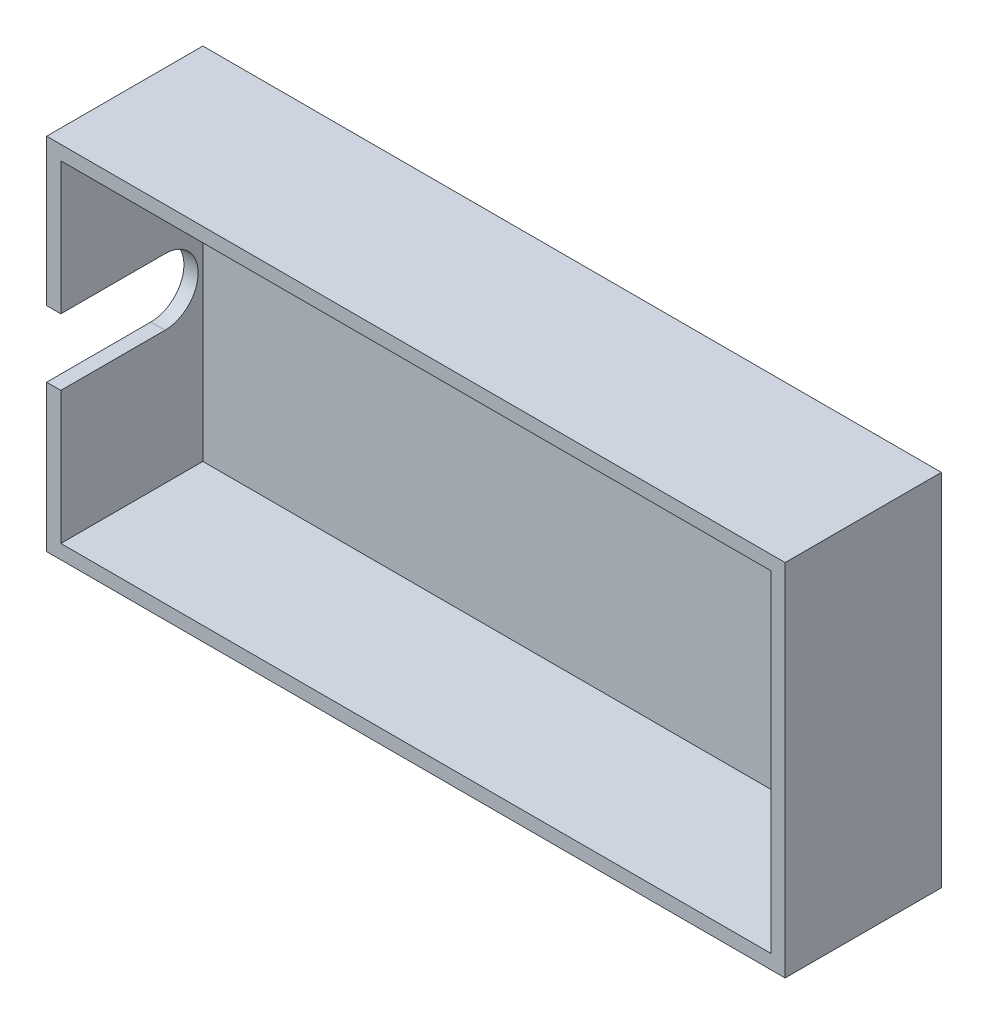
ISO-10303-21;
HEADER;
FILE_DESCRIPTION(('STEP AP214'),'2;1');
FILE_NAME('part.step','',(''),(''),'','','');
FILE_SCHEMA(('AUTOMOTIVE_DESIGN { 1 0 10303 214 1 1 1 1 }'));
ENDSEC;
DATA;
#1=APPLICATION_CONTEXT('core data for automotive mechanical design processes');
#2=APPLICATION_PROTOCOL_DEFINITION('international standard','automotive_design',2000,#1);
#3=PRODUCT_CONTEXT('',#1,'mechanical');
#4=PRODUCT('Part','Part','',(#3));
#5=PRODUCT_RELATED_PRODUCT_CATEGORY('part','',(#4));
#6=PRODUCT_DEFINITION_FORMATION('','',#4);
#7=PRODUCT_DEFINITION_CONTEXT('part definition',#1,'design');
#8=PRODUCT_DEFINITION('design','',#6,#7);
#9=PRODUCT_DEFINITION_SHAPE('','',#8);
#10=(LENGTH_UNIT() NAMED_UNIT(*) SI_UNIT(.MILLI.,.METRE.));
#11=(NAMED_UNIT(*) PLANE_ANGLE_UNIT() SI_UNIT($,.RADIAN.));
#12=(NAMED_UNIT(*) SI_UNIT($,.STERADIAN.) SOLID_ANGLE_UNIT());
#13=UNCERTAINTY_MEASURE_WITH_UNIT(LENGTH_MEASURE(1.E-05),#10,'distance_accuracy_value','');
#14=(GEOMETRIC_REPRESENTATION_CONTEXT(3) GLOBAL_UNCERTAINTY_ASSIGNED_CONTEXT((#13)) GLOBAL_UNIT_ASSIGNED_CONTEXT((#10,
#11,#12)) REPRESENTATION_CONTEXT('',''));
#15=CARTESIAN_POINT('',(0.,0.,0.));
#16=DIRECTION('',(0.,0.,1.));
#17=DIRECTION('',(1.,0.,0.));
#18=AXIS2_PLACEMENT_3D('',#15,#16,#17);
#19=CARTESIAN_POINT('',(-1.5,35.,15.));
#20=DIRECTION('',(1.,0.,0.));
#21=DIRECTION('',(0.,1.,0.));
#22=AXIS2_PLACEMENT_3D('',#19,#20,#21);
#23=PLANE('',#22);
#24=CARTESIAN_POINT('',(-1.5,17.5,4.));
#25=DIRECTION('',(-1.,0.,0.));
#26=DIRECTION('',(0.,-1.,0.));
#27=AXIS2_PLACEMENT_3D('',#24,#25,#26);
#28=CIRCLE('',#27,3.5);
#29=CARTESIAN_POINT('',(-1.5,21.,4.));
#30=VERTEX_POINT('',#29);
#31=CARTESIAN_POINT('',(-1.5,14.,4.));
#32=VERTEX_POINT('',#31);
#33=EDGE_CURVE('E132',#30,#32,#28,.T.);
#34=ORIENTED_EDGE('',*,*,#33,.F.);
#35=DIRECTION('',(0.,0.,-1.));
#36=VECTOR('',#35,1.);
#37=CARTESIAN_POINT('',(-1.5,21.,4.));
#38=LINE('',#37,#36);
#39=CARTESIAN_POINT('',(-1.5,21.,15.));
#40=VERTEX_POINT('',#39);
#41=EDGE_CURVE('E129',#40,#30,#38,.T.);
#42=ORIENTED_EDGE('',*,*,#41,.F.);
#43=DIRECTION('',(0.,-1.,0.));
#44=VECTOR('',#43,1.);
#45=CARTESIAN_POINT('',(-1.5,35.,15.));
#46=LINE('',#45,#44);
#47=CARTESIAN_POINT('',(-1.5,36.5,15.));
#48=VERTEX_POINT('',#47);
#49=EDGE_CURVE('E200',#48,#40,#46,.T.);
#50=ORIENTED_EDGE('',*,*,#49,.F.);
#51=DIRECTION('',(0.,0.,-1.));
#52=VECTOR('',#51,1.);
#53=CARTESIAN_POINT('',(-1.5,36.5,15.));
#54=LINE('',#53,#52);
#55=CARTESIAN_POINT('',(-1.5,36.5,-1.5));
#56=VERTEX_POINT('',#55);
#57=EDGE_CURVE('E186',#48,#56,#54,.T.);
#58=ORIENTED_EDGE('',*,*,#57,.T.);
#59=DIRECTION('',(0.,-1.,0.));
#60=VECTOR('',#59,1.);
#61=CARTESIAN_POINT('',(-1.5,35.,-1.5));
#62=LINE('',#61,#60);
#63=CARTESIAN_POINT('',(-1.5,-1.5,-1.5));
#64=VERTEX_POINT('',#63);
#65=EDGE_CURVE('E178',#56,#64,#62,.T.);
#66=ORIENTED_EDGE('',*,*,#65,.T.);
#67=DIRECTION('',(0.,0.,-1.));
#68=VECTOR('',#67,1.);
#69=CARTESIAN_POINT('',(-1.5,-1.5,15.));
#70=LINE('',#69,#68);
#71=CARTESIAN_POINT('',(-1.5,-1.5,15.));
#72=VERTEX_POINT('',#71);
#73=EDGE_CURVE('E182',#72,#64,#70,.T.);
#74=ORIENTED_EDGE('',*,*,#73,.F.);
#75=CARTESIAN_POINT('',(-1.5,14.,15.));
#76=VERTEX_POINT('',#75);
#77=EDGE_CURVE('E141',#76,#72,#46,.T.);
#78=ORIENTED_EDGE('',*,*,#77,.F.);
#79=DIRECTION('',(0.,0.,1.));
#80=VECTOR('',#79,1.);
#81=CARTESIAN_POINT('',(-1.5,14.,4.));
#82=LINE('',#81,#80);
#83=EDGE_CURVE('E124',#32,#76,#82,.T.);
#84=ORIENTED_EDGE('',*,*,#83,.F.);
#85=EDGE_LOOP('',(#34,#42,#50,#58,#66,#74,#78,#84));
#86=FACE_BOUND('',#85,.T.);
#87=ADVANCED_FACE('F33',(#86),#23,.F.);
#88=CARTESIAN_POINT('',(0.,-1.5,15.));
#89=DIRECTION('',(0.,1.,0.));
#90=DIRECTION('',(0.,0.,1.));
#91=AXIS2_PLACEMENT_3D('',#88,#89,#90);
#92=PLANE('',#91);
#93=DIRECTION('',(1.,0.,0.));
#94=VECTOR('',#93,1.);
#95=CARTESIAN_POINT('',(0.,-1.5,-1.5));
#96=LINE('',#95,#94);
#97=CARTESIAN_POINT('',(76.5,-1.5,-1.5));
#98=VERTEX_POINT('',#97);
#99=EDGE_CURVE('E181',#64,#98,#96,.T.);
#100=ORIENTED_EDGE('',*,*,#99,.T.);
#101=DIRECTION('',(0.,0.,-1.));
#102=VECTOR('',#101,1.);
#103=CARTESIAN_POINT('',(76.5,-1.5,15.));
#104=LINE('',#103,#102);
#105=CARTESIAN_POINT('',(76.5,-1.5,15.));
#106=VERTEX_POINT('',#105);
#107=EDGE_CURVE('E185',#106,#98,#104,.T.);
#108=ORIENTED_EDGE('',*,*,#107,.F.);
#109=DIRECTION('',(1.,0.,0.));
#110=VECTOR('',#109,1.);
#111=CARTESIAN_POINT('',(0.,-1.5,15.));
#112=LINE('',#111,#110);
#113=EDGE_CURVE('E203',#72,#106,#112,.T.);
#114=ORIENTED_EDGE('',*,*,#113,.F.);
#115=ORIENTED_EDGE('',*,*,#73,.T.);
#116=EDGE_LOOP('',(#100,#108,#114,#115));
#117=FACE_BOUND('',#116,.T.);
#118=ADVANCED_FACE('F232',(#117),#92,.F.);
#119=CARTESIAN_POINT('',(76.5,35.,15.));
#120=DIRECTION('',(-1.,0.,0.));
#121=DIRECTION('',(0.,-1.,0.));
#122=AXIS2_PLACEMENT_3D('',#119,#120,#121);
#123=PLANE('',#122);
#124=DIRECTION('',(0.,1.,0.));
#125=VECTOR('',#124,1.);
#126=CARTESIAN_POINT('',(76.5,35.,-1.5));
#127=LINE('',#126,#125);
#128=CARTESIAN_POINT('',(76.5,36.5,-1.5));
#129=VERTEX_POINT('',#128);
#130=EDGE_CURVE('E192',#98,#129,#127,.T.);
#131=ORIENTED_EDGE('',*,*,#130,.T.);
#132=DIRECTION('',(0.,0.,-1.));
#133=VECTOR('',#132,1.);
#134=CARTESIAN_POINT('',(76.5,36.5,15.));
#135=LINE('',#134,#133);
#136=CARTESIAN_POINT('',(76.5,36.5,15.));
#137=VERTEX_POINT('',#136);
#138=EDGE_CURVE('E189',#137,#129,#135,.T.);
#139=ORIENTED_EDGE('',*,*,#138,.F.);
#140=DIRECTION('',(0.,1.,0.));
#141=VECTOR('',#140,1.);
#142=CARTESIAN_POINT('',(76.5,35.,15.));
#143=LINE('',#142,#141);
#144=EDGE_CURVE('E205',#106,#137,#143,.T.);
#145=ORIENTED_EDGE('',*,*,#144,.F.);
#146=ORIENTED_EDGE('',*,*,#107,.T.);
#147=EDGE_LOOP('',(#131,#139,#145,#146));
#148=FACE_BOUND('',#147,.T.);
#149=ADVANCED_FACE('F260',(#148),#123,.F.);
#150=CARTESIAN_POINT('',(0.,36.5,15.));
#151=DIRECTION('',(0.,-1.,0.));
#152=DIRECTION('',(0.,0.,-1.));
#153=AXIS2_PLACEMENT_3D('',#150,#151,#152);
#154=PLANE('',#153);
#155=DIRECTION('',(-1.,0.,0.));
#156=VECTOR('',#155,1.);
#157=CARTESIAN_POINT('',(0.,36.5,-1.5));
#158=LINE('',#157,#156);
#159=EDGE_CURVE('E196',#129,#56,#158,.T.);
#160=ORIENTED_EDGE('',*,*,#159,.T.);
#161=ORIENTED_EDGE('',*,*,#57,.F.);
#162=DIRECTION('',(-1.,0.,0.));
#163=VECTOR('',#162,1.);
#164=CARTESIAN_POINT('',(0.,36.5,15.));
#165=LINE('',#164,#163);
#166=EDGE_CURVE('E190',#137,#48,#165,.T.);
#167=ORIENTED_EDGE('',*,*,#166,.F.);
#168=ORIENTED_EDGE('',*,*,#138,.T.);
#169=EDGE_LOOP('',(#160,#161,#167,#168));
#170=FACE_BOUND('',#169,.T.);
#171=ADVANCED_FACE('F266',(#170),#154,.F.);
#172=CARTESIAN_POINT('',(0.,0.,15.));
#173=DIRECTION('',(0.,0.,1.));
#174=DIRECTION('',(1.,0.,0.));
#175=AXIS2_PLACEMENT_3D('',#172,#173,#174);
#176=PLANE('',#175);
#177=DIRECTION('',(-1.,0.,0.));
#178=VECTOR('',#177,1.);
#179=CARTESIAN_POINT('',(0.,21.,15.));
#180=LINE('',#179,#178);
#181=CARTESIAN_POINT('',(0.,21.,15.));
#182=VERTEX_POINT('',#181);
#183=EDGE_CURVE('E147',#182,#40,#180,.T.);
#184=ORIENTED_EDGE('',*,*,#183,.F.);
#185=DIRECTION('',(0.,-1.,0.));
#186=VECTOR('',#185,1.);
#187=CARTESIAN_POINT('',(0.,35.,15.));
#188=LINE('',#187,#186);
#189=CARTESIAN_POINT('',(0.,35.,15.));
#190=VERTEX_POINT('',#189);
#191=EDGE_CURVE('E150',#190,#182,#188,.T.);
#192=ORIENTED_EDGE('',*,*,#191,.F.);
#193=DIRECTION('',(-1.,0.,0.));
#194=VECTOR('',#193,1.);
#195=CARTESIAN_POINT('',(0.,35.,15.));
#196=LINE('',#195,#194);
#197=CARTESIAN_POINT('',(75.,35.,15.));
#198=VERTEX_POINT('',#197);
#199=EDGE_CURVE('E158',#198,#190,#196,.T.);
#200=ORIENTED_EDGE('',*,*,#199,.F.);
#201=DIRECTION('',(0.,1.,0.));
#202=VECTOR('',#201,1.);
#203=CARTESIAN_POINT('',(75.,35.,15.));
#204=LINE('',#203,#202);
#205=CARTESIAN_POINT('',(75.,0.,15.));
#206=VERTEX_POINT('',#205);
#207=EDGE_CURVE('E156',#206,#198,#204,.T.);
#208=ORIENTED_EDGE('',*,*,#207,.F.);
#209=DIRECTION('',(1.,0.,0.));
#210=VECTOR('',#209,1.);
#211=CARTESIAN_POINT('',(0.,0.,15.));
#212=LINE('',#211,#210);
#213=CARTESIAN_POINT('',(0.,0.,15.));
#214=VERTEX_POINT('',#213);
#215=EDGE_CURVE('E153',#214,#206,#212,.T.);
#216=ORIENTED_EDGE('',*,*,#215,.F.);
#217=CARTESIAN_POINT('',(0.,14.,15.));
#218=VERTEX_POINT('',#217);
#219=EDGE_CURVE('E154',#218,#214,#188,.T.);
#220=ORIENTED_EDGE('',*,*,#219,.F.);
#221=DIRECTION('',(1.,0.,0.));
#222=VECTOR('',#221,1.);
#223=CARTESIAN_POINT('',(0.,14.,15.));
#224=LINE('',#223,#222);
#225=EDGE_CURVE('E48',#76,#218,#224,.T.);
#226=ORIENTED_EDGE('',*,*,#225,.F.);
#227=ORIENTED_EDGE('',*,*,#77,.T.);
#228=ORIENTED_EDGE('',*,*,#113,.T.);
#229=ORIENTED_EDGE('',*,*,#144,.T.);
#230=ORIENTED_EDGE('',*,*,#166,.T.);
#231=ORIENTED_EDGE('',*,*,#49,.T.);
#232=EDGE_LOOP('',(#184,#192,#200,#208,#216,#220,#226,#227,#228,#229,#230,#231));
#233=FACE_BOUND('',#232,.T.);
#234=ADVANCED_FACE('F219',(#233),#176,.T.);
#235=CARTESIAN_POINT('',(0.,0.,-1.5));
#236=DIRECTION('',(0.,0.,1.));
#237=DIRECTION('',(1.,0.,0.));
#238=AXIS2_PLACEMENT_3D('',#235,#236,#237);
#239=PLANE('',#238);
#240=ORIENTED_EDGE('',*,*,#65,.F.);
#241=ORIENTED_EDGE('',*,*,#159,.F.);
#242=ORIENTED_EDGE('',*,*,#130,.F.);
#243=ORIENTED_EDGE('',*,*,#99,.F.);
#244=EDGE_LOOP('',(#240,#241,#242,#243));
#245=FACE_BOUND('',#244,.T.);
#246=ADVANCED_FACE('F35',(#245),#239,.F.);
#247=CARTESIAN_POINT('',(0.,35.,15.));
#248=DIRECTION('',(1.,0.,0.));
#249=DIRECTION('',(0.,1.,0.));
#250=AXIS2_PLACEMENT_3D('',#247,#248,#249);
#251=PLANE('',#250);
#252=DIRECTION('',(0.,0.,1.));
#253=VECTOR('',#252,1.);
#254=CARTESIAN_POINT('',(0.,21.,15.));
#255=LINE('',#254,#253);
#256=CARTESIAN_POINT('',(0.,21.,4.));
#257=VERTEX_POINT('',#256);
#258=EDGE_CURVE('E11',#257,#182,#255,.T.);
#259=ORIENTED_EDGE('',*,*,#258,.F.);
#260=CARTESIAN_POINT('',(0.,17.5,4.));
#261=DIRECTION('',(1.,0.,0.));
#262=DIRECTION('',(0.,1.,0.));
#263=AXIS2_PLACEMENT_3D('',#260,#261,#262);
#264=CIRCLE('',#263,3.5);
#265=CARTESIAN_POINT('',(0.,14.,4.));
#266=VERTEX_POINT('',#265);
#267=EDGE_CURVE('E41',#266,#257,#264,.T.);
#268=ORIENTED_EDGE('',*,*,#267,.F.);
#269=DIRECTION('',(0.,0.,-1.));
#270=VECTOR('',#269,1.);
#271=CARTESIAN_POINT('',(0.,14.,15.));
#272=LINE('',#271,#270);
#273=EDGE_CURVE('E125',#218,#266,#272,.T.);
#274=ORIENTED_EDGE('',*,*,#273,.F.);
#275=ORIENTED_EDGE('',*,*,#219,.T.);
#276=DIRECTION('',(0.,0.,-1.));
#277=VECTOR('',#276,1.);
#278=CARTESIAN_POINT('',(0.,0.,15.));
#279=LINE('',#278,#277);
#280=CARTESIAN_POINT('',(0.,0.,0.));
#281=VERTEX_POINT('',#280);
#282=EDGE_CURVE('E175',#214,#281,#279,.T.);
#283=ORIENTED_EDGE('',*,*,#282,.T.);
#284=DIRECTION('',(0.,-1.,0.));
#285=VECTOR('',#284,1.);
#286=CARTESIAN_POINT('',(0.,35.,0.));
#287=LINE('',#286,#285);
#288=CARTESIAN_POINT('',(0.,35.,0.));
#289=VERTEX_POINT('',#288);
#290=EDGE_CURVE('E149',#289,#281,#287,.T.);
#291=ORIENTED_EDGE('',*,*,#290,.F.);
#292=DIRECTION('',(0.,0.,-1.));
#293=VECTOR('',#292,1.);
#294=CARTESIAN_POINT('',(0.,35.,15.));
#295=LINE('',#294,#293);
#296=EDGE_CURVE('E160',#190,#289,#295,.T.);
#297=ORIENTED_EDGE('',*,*,#296,.F.);
#298=ORIENTED_EDGE('',*,*,#191,.T.);
#299=EDGE_LOOP('',(#259,#268,#274,#275,#283,#291,#297,#298));
#300=FACE_BOUND('',#299,.T.);
#301=ADVANCED_FACE('F213',(#300),#251,.T.);
#302=CARTESIAN_POINT('',(0.,0.,15.));
#303=DIRECTION('',(0.,1.,0.));
#304=DIRECTION('',(0.,0.,1.));
#305=AXIS2_PLACEMENT_3D('',#302,#303,#304);
#306=PLANE('',#305);
#307=DIRECTION('',(1.,0.,0.));
#308=VECTOR('',#307,1.);
#309=CARTESIAN_POINT('',(0.,0.,0.));
#310=LINE('',#309,#308);
#311=CARTESIAN_POINT('',(75.,0.,0.));
#312=VERTEX_POINT('',#311);
#313=EDGE_CURVE('E163',#281,#312,#310,.T.);
#314=ORIENTED_EDGE('',*,*,#313,.F.);
#315=ORIENTED_EDGE('',*,*,#282,.F.);
#316=ORIENTED_EDGE('',*,*,#215,.T.);
#317=DIRECTION('',(0.,0.,-1.));
#318=VECTOR('',#317,1.);
#319=CARTESIAN_POINT('',(75.,0.,15.));
#320=LINE('',#319,#318);
#321=EDGE_CURVE('E172',#206,#312,#320,.T.);
#322=ORIENTED_EDGE('',*,*,#321,.T.);
#323=EDGE_LOOP('',(#314,#315,#316,#322));
#324=FACE_BOUND('',#323,.T.);
#325=ADVANCED_FACE('F239',(#324),#306,.T.);
#326=CARTESIAN_POINT('',(75.,35.,15.));
#327=DIRECTION('',(-1.,0.,0.));
#328=DIRECTION('',(0.,-1.,0.));
#329=AXIS2_PLACEMENT_3D('',#326,#327,#328);
#330=PLANE('',#329);
#331=DIRECTION('',(0.,1.,0.));
#332=VECTOR('',#331,1.);
#333=CARTESIAN_POINT('',(75.,35.,0.));
#334=LINE('',#333,#332);
#335=CARTESIAN_POINT('',(75.,35.,0.));
#336=VERTEX_POINT('',#335);
#337=EDGE_CURVE('E165',#312,#336,#334,.T.);
#338=ORIENTED_EDGE('',*,*,#337,.F.);
#339=ORIENTED_EDGE('',*,*,#321,.F.);
#340=ORIENTED_EDGE('',*,*,#207,.T.);
#341=DIRECTION('',(0.,0.,-1.));
#342=VECTOR('',#341,1.);
#343=CARTESIAN_POINT('',(75.,35.,15.));
#344=LINE('',#343,#342);
#345=EDGE_CURVE('E56',#198,#336,#344,.T.);
#346=ORIENTED_EDGE('',*,*,#345,.T.);
#347=EDGE_LOOP('',(#338,#339,#340,#346));
#348=FACE_BOUND('',#347,.T.);
#349=ADVANCED_FACE('F246',(#348),#330,.T.);
#350=CARTESIAN_POINT('',(0.,35.,15.));
#351=DIRECTION('',(0.,-1.,0.));
#352=DIRECTION('',(0.,0.,-1.));
#353=AXIS2_PLACEMENT_3D('',#350,#351,#352);
#354=PLANE('',#353);
#355=DIRECTION('',(-1.,0.,0.));
#356=VECTOR('',#355,1.);
#357=CARTESIAN_POINT('',(0.,35.,0.));
#358=LINE('',#357,#356);
#359=EDGE_CURVE('E167',#336,#289,#358,.T.);
#360=ORIENTED_EDGE('',*,*,#359,.F.);
#361=ORIENTED_EDGE('',*,*,#345,.F.);
#362=ORIENTED_EDGE('',*,*,#199,.T.);
#363=ORIENTED_EDGE('',*,*,#296,.T.);
#364=EDGE_LOOP('',(#360,#361,#362,#363));
#365=FACE_BOUND('',#364,.T.);
#366=ADVANCED_FACE('F244',(#365),#354,.T.);
#367=CARTESIAN_POINT('',(0.,0.,0.));
#368=DIRECTION('',(0.,0.,1.));
#369=DIRECTION('',(1.,0.,0.));
#370=AXIS2_PLACEMENT_3D('',#367,#368,#369);
#371=PLANE('',#370);
#372=ORIENTED_EDGE('',*,*,#290,.T.);
#373=ORIENTED_EDGE('',*,*,#313,.T.);
#374=ORIENTED_EDGE('',*,*,#337,.T.);
#375=ORIENTED_EDGE('',*,*,#359,.T.);
#376=EDGE_LOOP('',(#372,#373,#374,#375));
#377=FACE_BOUND('',#376,.T.);
#378=ADVANCED_FACE('F243',(#377),#371,.T.);
#379=CARTESIAN_POINT('',(13.5,17.5,4.));
#380=DIRECTION('',(-1.,0.,0.));
#381=DIRECTION('',(0.,-1.,0.));
#382=AXIS2_PLACEMENT_3D('',#379,#380,#381);
#383=CYLINDRICAL_SURFACE('',#382,3.5);
#384=ORIENTED_EDGE('',*,*,#267,.T.);
#385=DIRECTION('',(-1.,0.,0.));
#386=VECTOR('',#385,1.);
#387=CARTESIAN_POINT('',(13.5,21.,4.));
#388=LINE('',#387,#386);
#389=EDGE_CURVE('E128',#257,#30,#388,.T.);
#390=ORIENTED_EDGE('',*,*,#389,.T.);
#391=ORIENTED_EDGE('',*,*,#33,.T.);
#392=DIRECTION('',(-1.,0.,0.));
#393=VECTOR('',#392,1.);
#394=CARTESIAN_POINT('',(13.5,14.,4.));
#395=LINE('',#394,#393);
#396=EDGE_CURVE('E120',#266,#32,#395,.T.);
#397=ORIENTED_EDGE('',*,*,#396,.F.);
#398=EDGE_LOOP('',(#384,#390,#391,#397));
#399=FACE_BOUND('',#398,.T.);
#400=ADVANCED_FACE('F133',(#399),#383,.F.);
#401=CARTESIAN_POINT('',(13.5,21.,4.));
#402=DIRECTION('',(0.,1.,0.));
#403=DIRECTION('',(-1.,0.,0.));
#404=AXIS2_PLACEMENT_3D('',#401,#402,#403);
#405=PLANE('',#404);
#406=ORIENTED_EDGE('',*,*,#183,.T.);
#407=ORIENTED_EDGE('',*,*,#41,.T.);
#408=ORIENTED_EDGE('',*,*,#389,.F.);
#409=ORIENTED_EDGE('',*,*,#258,.T.);
#410=EDGE_LOOP('',(#406,#407,#408,#409));
#411=FACE_BOUND('',#410,.T.);
#412=ADVANCED_FACE('F211',(#411),#405,.F.);
#413=CARTESIAN_POINT('',(13.5,14.,4.));
#414=DIRECTION('',(0.,-1.,0.));
#415=DIRECTION('',(1.,0.,0.));
#416=AXIS2_PLACEMENT_3D('',#413,#414,#415);
#417=PLANE('',#416);
#418=ORIENTED_EDGE('',*,*,#225,.T.);
#419=ORIENTED_EDGE('',*,*,#273,.T.);
#420=ORIENTED_EDGE('',*,*,#396,.T.);
#421=ORIENTED_EDGE('',*,*,#83,.T.);
#422=EDGE_LOOP('',(#418,#419,#420,#421));
#423=FACE_BOUND('',#422,.T.);
#424=ADVANCED_FACE('F122',(#423),#417,.F.);
#425=CLOSED_SHELL('',(#87,#118,#149,#171,#234,#246,#301,#325,#349,#366,#378,#400,#412,#424));
#426=MANIFOLD_SOLID_BREP('B2',#425);
#427=ADVANCED_BREP_SHAPE_REPRESENTATION('',(#18,#426),#14);
#428=SHAPE_DEFINITION_REPRESENTATION(#9,#427);
ENDSEC;
END-ISO-10303-21;
